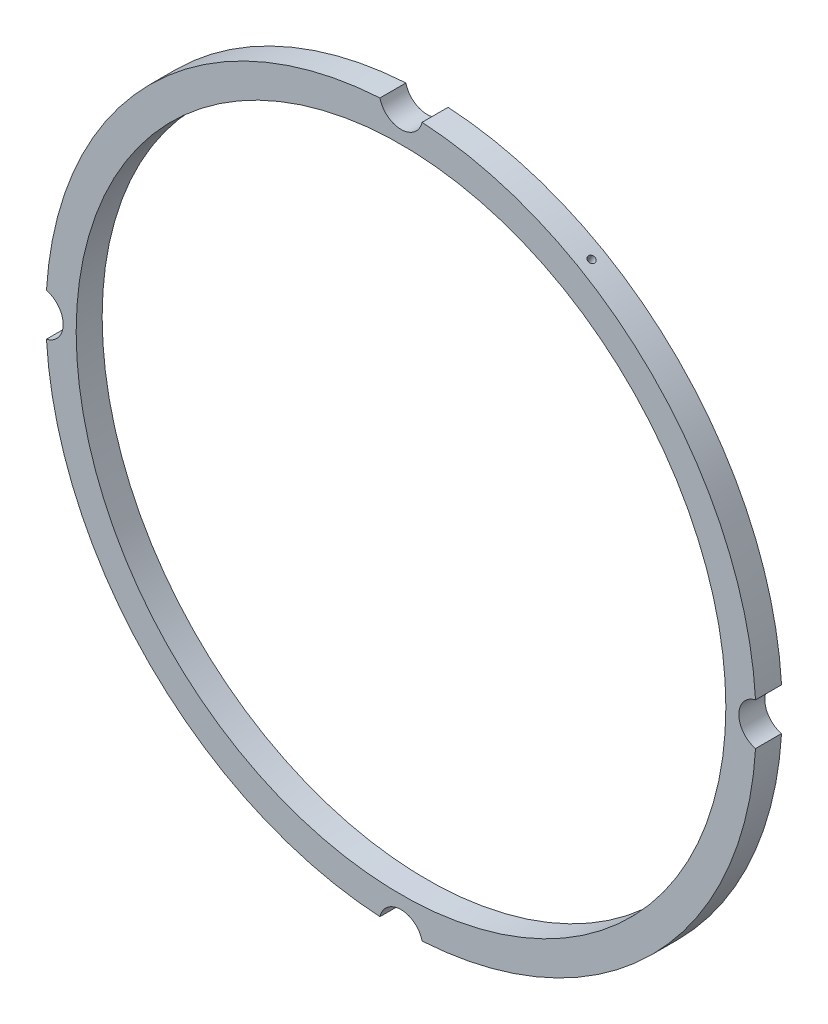
ISO-10303-21;
HEADER;
FILE_DESCRIPTION(('STEP AP214'),'2;1');
FILE_NAME('part.step','',(''),(''),'','','');
FILE_SCHEMA(('AUTOMOTIVE_DESIGN { 1 0 10303 214 1 1 1 1 }'));
ENDSEC;
DATA;
#1=APPLICATION_CONTEXT('core data for automotive mechanical design processes');
#2=APPLICATION_PROTOCOL_DEFINITION('international standard','automotive_design',2000,#1);
#3=PRODUCT_CONTEXT('',#1,'mechanical');
#4=PRODUCT('Part','Part','',(#3));
#5=PRODUCT_RELATED_PRODUCT_CATEGORY('part','',(#4));
#6=PRODUCT_DEFINITION_FORMATION('','',#4);
#7=PRODUCT_DEFINITION_CONTEXT('part definition',#1,'design');
#8=PRODUCT_DEFINITION('design','',#6,#7);
#9=PRODUCT_DEFINITION_SHAPE('','',#8);
#10=(LENGTH_UNIT() NAMED_UNIT(*) SI_UNIT(.MILLI.,.METRE.));
#11=(NAMED_UNIT(*) PLANE_ANGLE_UNIT() SI_UNIT($,.RADIAN.));
#12=(NAMED_UNIT(*) SI_UNIT($,.STERADIAN.) SOLID_ANGLE_UNIT());
#13=UNCERTAINTY_MEASURE_WITH_UNIT(LENGTH_MEASURE(1.E-05),#10,'distance_accuracy_value','');
#14=(GEOMETRIC_REPRESENTATION_CONTEXT(3) GLOBAL_UNCERTAINTY_ASSIGNED_CONTEXT((#13)) GLOBAL_UNIT_ASSIGNED_CONTEXT((#10,
#11,#12)) REPRESENTATION_CONTEXT('',''));
#15=CARTESIAN_POINT('',(0.,0.,0.));
#16=DIRECTION('',(0.,0.,1.));
#17=DIRECTION('',(1.,0.,0.));
#18=AXIS2_PLACEMENT_3D('',#15,#16,#17);
#19=CARTESIAN_POINT('',(0.,0.,6.));
#20=DIRECTION('',(0.,0.,-1.));
#21=DIRECTION('',(-1.,0.,0.));
#22=AXIS2_PLACEMENT_3D('',#19,#20,#21);
#23=CYLINDRICAL_SURFACE('',#22,82.);
#24=CARTESIAN_POINT('',(0.,0.,0.));
#25=DIRECTION('',(0.,0.,1.));
#26=DIRECTION('',(1.,0.,0.));
#27=AXIS2_PLACEMENT_3D('',#24,#25,#26);
#28=CIRCLE('',#27,82.);
#29=CARTESIAN_POINT('',(-4.86723129559619,81.855421686747,0.));
#30=VERTEX_POINT('',#29);
#31=CARTESIAN_POINT('',(-81.8554216867469,4.86723129559705,0.));
#32=VERTEX_POINT('',#31);
#33=EDGE_CURVE('E123',#30,#32,#28,.T.);
#34=ORIENTED_EDGE('',*,*,#33,.T.);
#35=DIRECTION('',(0.,0.,1.));
#36=VECTOR('',#35,1.);
#37=CARTESIAN_POINT('',(-81.8554216867469,4.86723129559704,3.));
#38=LINE('',#37,#36);
#39=CARTESIAN_POINT('',(-81.8554216867469,4.86723129559704,6.));
#40=VERTEX_POINT('',#39);
#41=EDGE_CURVE('E56',#32,#40,#38,.T.);
#42=ORIENTED_EDGE('',*,*,#41,.T.);
#43=CARTESIAN_POINT('',(0.,0.,6.));
#44=DIRECTION('',(0.,0.,1.));
#45=DIRECTION('',(1.,0.,0.));
#46=AXIS2_PLACEMENT_3D('',#43,#44,#45);
#47=CIRCLE('',#46,82.);
#48=CARTESIAN_POINT('',(-4.86723129559619,81.855421686747,6.));
#49=VERTEX_POINT('',#48);
#50=EDGE_CURVE('E130',#49,#40,#47,.T.);
#51=ORIENTED_EDGE('',*,*,#50,.F.);
#52=DIRECTION('',(0.,0.,1.));
#53=VECTOR('',#52,1.);
#54=CARTESIAN_POINT('',(-4.86723129559619,81.855421686747,3.));
#55=LINE('',#54,#53);
#56=EDGE_CURVE('E132',#49,#30,#55,.F.);
#57=ORIENTED_EDGE('',*,*,#56,.T.);
#58=EDGE_LOOP('',(#34,#42,#51,#57));
#59=FACE_BOUND('',#58,.T.);
#60=ADVANCED_FACE('F37',(#59),#23,.T.);
#61=CARTESIAN_POINT('',(-81.8554216867471,-4.86723129559533,6.));
#62=VERTEX_POINT('',#61);
#63=CARTESIAN_POINT('',(-4.86723129559619,-81.855421686747,6.));
#64=VERTEX_POINT('',#63);
#65=EDGE_CURVE('E116',#62,#64,#47,.T.);
#66=ORIENTED_EDGE('',*,*,#65,.F.);
#67=DIRECTION('',(0.,0.,1.));
#68=VECTOR('',#67,1.);
#69=CARTESIAN_POINT('',(-81.8554216867471,-4.86723129559533,3.));
#70=LINE('',#69,#68);
#71=CARTESIAN_POINT('',(-81.8554216867471,-4.86723129559533,0.));
#72=VERTEX_POINT('',#71);
#73=EDGE_CURVE('E107',#62,#72,#70,.F.);
#74=ORIENTED_EDGE('',*,*,#73,.T.);
#75=CARTESIAN_POINT('',(-4.86723129559619,-81.855421686747,0.));
#76=VERTEX_POINT('',#75);
#77=EDGE_CURVE('E64',#72,#76,#28,.T.);
#78=ORIENTED_EDGE('',*,*,#77,.T.);
#79=DIRECTION('',(0.,0.,1.));
#80=VECTOR('',#79,1.);
#81=CARTESIAN_POINT('',(-4.86723129559619,-81.855421686747,3.));
#82=LINE('',#81,#80);
#83=EDGE_CURVE('E161',#76,#64,#82,.T.);
#84=ORIENTED_EDGE('',*,*,#83,.T.);
#85=EDGE_LOOP('',(#66,#74,#78,#84));
#86=FACE_BOUND('',#85,.T.);
#87=ADVANCED_FACE('F115',(#86),#23,.T.);
#88=CARTESIAN_POINT('',(4.86723129559619,-81.855421686747,6.));
#89=VERTEX_POINT('',#88);
#90=CARTESIAN_POINT('',(81.855421686747,-4.86723129559647,6.));
#91=VERTEX_POINT('',#90);
#92=EDGE_CURVE('E146',#89,#91,#47,.T.);
#93=ORIENTED_EDGE('',*,*,#92,.F.);
#94=DIRECTION('',(0.,0.,1.));
#95=VECTOR('',#94,1.);
#96=CARTESIAN_POINT('',(4.86723129559619,-81.855421686747,3.));
#97=LINE('',#96,#95);
#98=CARTESIAN_POINT('',(4.86723129559619,-81.855421686747,0.));
#99=VERTEX_POINT('',#98);
#100=EDGE_CURVE('E214',#89,#99,#97,.F.);
#101=ORIENTED_EDGE('',*,*,#100,.T.);
#102=CARTESIAN_POINT('',(81.855421686747,-4.86723129559647,0.));
#103=VERTEX_POINT('',#102);
#104=EDGE_CURVE('E124',#99,#103,#28,.T.);
#105=ORIENTED_EDGE('',*,*,#104,.T.);
#106=DIRECTION('',(0.,0.,1.));
#107=VECTOR('',#106,1.);
#108=CARTESIAN_POINT('',(81.855421686747,-4.86723129559647,3.));
#109=LINE('',#108,#107);
#110=EDGE_CURVE('E49',#103,#91,#109,.T.);
#111=ORIENTED_EDGE('',*,*,#110,.T.);
#112=EDGE_LOOP('',(#93,#101,#105,#111));
#113=FACE_BOUND('',#112,.T.);
#114=ADVANCED_FACE('F144',(#113),#23,.T.);
#115=CARTESIAN_POINT('',(0.,0.,6.));
#116=DIRECTION('',(0.,0.,1.));
#117=DIRECTION('',(1.,0.,0.));
#118=AXIS2_PLACEMENT_3D('',#115,#116,#117);
#119=PLANE('',#118);
#120=CARTESIAN_POINT('',(-83.,8.6937885337194E-13,6.));
#121=DIRECTION('',(0.,0.,1.));
#122=DIRECTION('',(0.,1.,0.));
#123=AXIS2_PLACEMENT_3D('',#120,#121,#122);
#124=CIRCLE('',#123,5.);
#125=EDGE_CURVE('E112',#62,#40,#124,.T.);
#126=ORIENTED_EDGE('',*,*,#125,.F.);
#127=ORIENTED_EDGE('',*,*,#65,.T.);
#128=CARTESIAN_POINT('',(0.,-83.,6.));
#129=DIRECTION('',(0.,0.,1.));
#130=DIRECTION('',(-1.,0.,0.));
#131=AXIS2_PLACEMENT_3D('',#128,#129,#130);
#132=CIRCLE('',#131,5.);
#133=EDGE_CURVE('E206',#89,#64,#132,.T.);
#134=ORIENTED_EDGE('',*,*,#133,.F.);
#135=ORIENTED_EDGE('',*,*,#92,.T.);
#136=CARTESIAN_POINT('',(83.,-2.8979295112398E-13,6.));
#137=DIRECTION('',(0.,0.,1.));
#138=DIRECTION('',(0.,-1.,0.));
#139=AXIS2_PLACEMENT_3D('',#136,#137,#138);
#140=CIRCLE('',#139,5.);
#141=CARTESIAN_POINT('',(81.855421686747,4.8672312955959,6.));
#142=VERTEX_POINT('',#141);
#143=EDGE_CURVE('E153',#142,#91,#140,.T.);
#144=ORIENTED_EDGE('',*,*,#143,.F.);
#145=CARTESIAN_POINT('',(4.86723129559619,81.855421686747,6.));
#146=VERTEX_POINT('',#145);
#147=EDGE_CURVE('E126',#142,#146,#47,.T.);
#148=ORIENTED_EDGE('',*,*,#147,.T.);
#149=CARTESIAN_POINT('',(0.,83.,6.));
#150=DIRECTION('',(0.,0.,1.));
#151=DIRECTION('',(1.,0.,0.));
#152=AXIS2_PLACEMENT_3D('',#149,#150,#151);
#153=CIRCLE('',#152,5.);
#154=EDGE_CURVE('E156',#49,#146,#153,.T.);
#155=ORIENTED_EDGE('',*,*,#154,.F.);
#156=ORIENTED_EDGE('',*,*,#50,.T.);
#157=EDGE_LOOP('',(#126,#127,#134,#135,#144,#148,#155,#156));
#158=FACE_BOUND('',#157,.T.);
#159=CARTESIAN_POINT('',(0.,0.,6.));
#160=DIRECTION('',(0.,0.,1.));
#161=DIRECTION('',(1.,0.,0.));
#162=AXIS2_PLACEMENT_3D('',#159,#160,#161);
#163=CIRCLE('',#162,75.);
#164=CARTESIAN_POINT('',(75.,0.,6.));
#165=VERTEX_POINT('',#164);
#166=EDGE_CURVE('E168',#165,#165,#163,.T.);
#167=ORIENTED_EDGE('',*,*,#166,.F.);
#168=EDGE_LOOP('',(#167));
#169=FACE_BOUND('',#168,.T.);
#170=ADVANCED_FACE('F202',(#158,#169),#119,.T.);
#171=CARTESIAN_POINT('',(0.,0.,0.));
#172=DIRECTION('',(0.,0.,1.));
#173=DIRECTION('',(1.,0.,0.));
#174=AXIS2_PLACEMENT_3D('',#171,#172,#173);
#175=PLANE('',#174);
#176=ORIENTED_EDGE('',*,*,#77,.F.);
#177=CARTESIAN_POINT('',(-83.,8.6937885337194E-13,0.));
#178=DIRECTION('',(0.,0.,1.));
#179=DIRECTION('',(0.,1.,0.));
#180=AXIS2_PLACEMENT_3D('',#177,#178,#179);
#181=CIRCLE('',#180,5.);
#182=EDGE_CURVE('E105',#72,#32,#181,.T.);
#183=ORIENTED_EDGE('',*,*,#182,.T.);
#184=ORIENTED_EDGE('',*,*,#33,.F.);
#185=CARTESIAN_POINT('',(0.,83.,0.));
#186=DIRECTION('',(0.,0.,1.));
#187=DIRECTION('',(1.,0.,0.));
#188=AXIS2_PLACEMENT_3D('',#185,#186,#187);
#189=CIRCLE('',#188,5.);
#190=CARTESIAN_POINT('',(4.86723129559619,81.855421686747,0.));
#191=VERTEX_POINT('',#190);
#192=EDGE_CURVE('E159',#30,#191,#189,.T.);
#193=ORIENTED_EDGE('',*,*,#192,.T.);
#194=CARTESIAN_POINT('',(81.855421686747,4.8672312955959,0.));
#195=VERTEX_POINT('',#194);
#196=EDGE_CURVE('E127',#195,#191,#28,.T.);
#197=ORIENTED_EDGE('',*,*,#196,.F.);
#198=CARTESIAN_POINT('',(83.,-2.8979295112398E-13,0.));
#199=DIRECTION('',(0.,0.,1.));
#200=DIRECTION('',(0.,-1.,0.));
#201=AXIS2_PLACEMENT_3D('',#198,#199,#200);
#202=CIRCLE('',#201,5.);
#203=EDGE_CURVE('E151',#195,#103,#202,.T.);
#204=ORIENTED_EDGE('',*,*,#203,.T.);
#205=ORIENTED_EDGE('',*,*,#104,.F.);
#206=CARTESIAN_POINT('',(0.,-83.,0.));
#207=DIRECTION('',(0.,0.,1.));
#208=DIRECTION('',(-1.,0.,0.));
#209=AXIS2_PLACEMENT_3D('',#206,#207,#208);
#210=CIRCLE('',#209,5.);
#211=EDGE_CURVE('E122',#99,#76,#210,.T.);
#212=ORIENTED_EDGE('',*,*,#211,.T.);
#213=EDGE_LOOP('',(#176,#183,#184,#193,#197,#204,#205,#212));
#214=FACE_BOUND('',#213,.T.);
#215=CARTESIAN_POINT('',(0.,0.,0.));
#216=DIRECTION('',(0.,0.,1.));
#217=DIRECTION('',(1.,0.,0.));
#218=AXIS2_PLACEMENT_3D('',#215,#216,#217);
#219=CIRCLE('',#218,75.);
#220=CARTESIAN_POINT('',(75.,0.,0.));
#221=VERTEX_POINT('',#220);
#222=EDGE_CURVE('E166',#221,#221,#219,.T.);
#223=ORIENTED_EDGE('',*,*,#222,.T.);
#224=EDGE_LOOP('',(#223));
#225=FACE_BOUND('',#224,.T.);
#226=ADVANCED_FACE('F119',(#214,#225),#175,.F.);
#227=CARTESIAN_POINT('',(40.3052284110281,71.4107034185693,3.));
#228=CARTESIAN_POINT('',(40.305230162785,71.4107024681233,2.95506479609301));
#229=CARTESIAN_POINT('',(40.3085368078791,71.40883642493,2.91009703714875));
#230=CARTESIAN_POINT('',(40.3216802135916,71.4014156688339,2.82140003350558));
#231=CARTESIAN_POINT('',(40.3315248278901,71.3958565196163,2.7776723443821));
#232=CARTESIAN_POINT('',(40.3574592527584,71.3811999286591,2.69275330768963));
#233=CARTESIAN_POINT('',(40.3735460727166,71.3721041812829,2.6515607564808));
#234=CARTESIAN_POINT('',(40.4114971299767,71.3506227921757,2.57287429083479));
#235=CARTESIAN_POINT('',(40.4333599334488,71.3382379669211,2.53537946164327));
#236=CARTESIAN_POINT('',(40.4822388609424,71.3105120161913,2.46513443541361));
#237=CARTESIAN_POINT('',(40.5092556770344,71.2951704936937,2.43238487660122));
#238=CARTESIAN_POINT('',(40.5676657214676,71.2619507473826,2.37256517048709));
#239=CARTESIAN_POINT('',(40.59905912185,71.2440724238483,2.34549524655357));
#240=CARTESIAN_POINT('',(40.6653214679689,71.2062713712898,2.29780471692709));
#241=CARTESIAN_POINT('',(40.7001904182244,71.1863486396075,2.27718411961991));
#242=CARTESIAN_POINT('',(40.772406334745,71.1450111456783,2.24297779787521));
#243=CARTESIAN_POINT('',(40.8097532955037,71.1235963867468,2.22939205780613));
#244=CARTESIAN_POINT('',(40.8858585322044,71.0798740635081,2.2096414437845));
#245=CARTESIAN_POINT('',(40.9246167652487,71.0575665263361,2.20347634446412));
#246=CARTESIAN_POINT('',(41.0024427076472,71.0126869615936,2.19874133559804));
#247=CARTESIAN_POINT('',(41.0415104163721,70.9901149345609,2.20017141060813));
#248=CARTESIAN_POINT('',(41.1188455717403,70.945348935138,2.21058592631372));
#249=CARTESIAN_POINT('',(41.1571130452983,70.9231549500377,2.21957011251892));
#250=CARTESIAN_POINT('',(41.2317665366884,70.8797805669154,2.24483743505819));
#251=CARTESIAN_POINT('',(41.2681525523058,70.8586001700864,2.26112057998316));
#252=CARTESIAN_POINT('',(41.3380172194721,70.8178647619419,2.3005238820961));
#253=CARTESIAN_POINT('',(41.3714958216182,70.7983097782456,2.32364415543101));
#254=CARTESIAN_POINT('',(41.434603016724,70.7613949232539,2.37606530348474));
#255=CARTESIAN_POINT('',(41.4642316101463,70.7440350516948,2.40536617746083));
#256=CARTESIAN_POINT('',(41.5188083007378,70.7120185025764,2.46931822819109));
#257=CARTESIAN_POINT('',(41.5437562021976,70.6973619380483,2.5039696285513));
#258=CARTESIAN_POINT('',(41.5882710512857,70.6711849340483,2.57763829735254));
#259=CARTESIAN_POINT('',(41.6078379981956,70.6596644949952,2.61665556637642));
#260=CARTESIAN_POINT('',(41.641043626485,70.640100926749,2.69794850712354));
#261=CARTESIAN_POINT('',(41.6546823022913,70.6320578008251,2.74022418191001));
#262=CARTESIAN_POINT('',(41.6756502729947,70.6196879331484,2.8268337992777));
#263=CARTESIAN_POINT('',(41.6829795699621,70.6153611901761,2.87116774118354));
#264=CARTESIAN_POINT('',(41.6911239668386,70.6105530728755,2.96063342804992));
#265=CARTESIAN_POINT('',(41.6919393353669,70.6100715399797,3.00576514003536));
#266=CARTESIAN_POINT('',(41.6870338226723,70.6129677812092,3.09554693556317));
#267=CARTESIAN_POINT('',(41.6813129419862,70.6163455550177,3.14019701914508));
#268=CARTESIAN_POINT('',(41.6634948178797,70.6268596602104,3.22774720890134));
#269=CARTESIAN_POINT('',(41.6513976958952,70.6339959200141,3.27064734838672));
#270=CARTESIAN_POINT('',(41.6211650638207,70.6518147314161,3.3534808607507));
#271=CARTESIAN_POINT('',(41.6030295531477,70.6624972833568,3.39341423334282));
#272=CARTESIAN_POINT('',(41.5612265203059,70.6870924286367,3.46918206255699));
#273=CARTESIAN_POINT('',(41.537558817141,70.7010051276562,3.50501638501377));
#274=CARTESIAN_POINT('',(41.4853544455829,70.7316497769729,3.57156755198845));
#275=CARTESIAN_POINT('',(41.4568177741148,70.7483817290505,3.60228439327473));
#276=CARTESIAN_POINT('',(41.3956750206665,70.7841743762166,3.65772966893017));
#277=CARTESIAN_POINT('',(41.3630688010143,70.8032351500882,3.68245790062276));
#278=CARTESIAN_POINT('',(41.2947046718655,70.8431290267123,3.72522259144113));
#279=CARTESIAN_POINT('',(41.2589467660966,70.8639621273686,3.74325905848162));
#280=CARTESIAN_POINT('',(41.1852880913143,70.9067969831621,3.77212789441348));
#281=CARTESIAN_POINT('',(41.1473873619883,70.9287987166545,3.78296039668251));
#282=CARTESIAN_POINT('',(41.0705139344065,70.9733390629306,3.7971142516783));
#283=CARTESIAN_POINT('',(41.0315412345227,70.9958776765296,3.80043559299622));
#284=CARTESIAN_POINT('',(40.9536306752187,71.0408485140235,3.79947279646205));
#285=CARTESIAN_POINT('',(40.9146928143604,71.0632807424909,3.7951889885238));
#286=CARTESIAN_POINT('',(40.8379572703114,71.1074061241529,3.77913815237901));
#287=CARTESIAN_POINT('',(40.8001595894107,71.129099275863,3.76737110914376));
#288=CARTESIAN_POINT('',(40.7267814451327,71.1711392536284,3.73668763250792));
#289=CARTESIAN_POINT('',(40.6912010228659,71.1914860547211,3.71777106659268));
#290=CARTESIAN_POINT('',(40.6232765406942,71.2302669838026,3.67332635454546));
#291=CARTESIAN_POINT('',(40.5909323548439,71.2487011862253,3.6477984658466));
#292=CARTESIAN_POINT('',(40.5304074104666,71.2831487094411,3.59085755066492));
#293=CARTESIAN_POINT('',(40.5022263893502,71.2991621829217,3.55944489564428));
#294=CARTESIAN_POINT('',(40.4508278504761,71.328335198352,3.49161477008844));
#295=CARTESIAN_POINT('',(40.4276115676375,71.3414940302556,3.45519605804873));
#296=CARTESIAN_POINT('',(40.3868099222115,71.3646000206399,3.37838044791628));
#297=CARTESIAN_POINT('',(40.3692273551643,71.3745455846659,3.33798158776968));
#298=CARTESIAN_POINT('',(40.340231691055,71.3909377104108,3.25439747070504));
#299=CARTESIAN_POINT('',(40.3288112020707,71.3973884644812,3.21121562216789));
#300=CARTESIAN_POINT('',(40.3155112248783,71.4048988976244,3.13979902324666));
#301=CARTESIAN_POINT('',(40.3116600520628,71.4070729879977,3.11202827082365));
#302=CARTESIAN_POINT('',(40.3065180975612,71.4099755455663,3.05617592082972));
#303=CARTESIAN_POINT('',(40.3052273157971,71.4107040128057,3.02809432326828));
#304=CARTESIAN_POINT('',(40.3052284110281,71.4107034185693,3.));
#305=B_SPLINE_CURVE_WITH_KNOTS('',3,(#227,#228,#229,#230,#231,#232,#233,#234,#235,#236,#237,
#238,#239,#240,#241,#242,#243,#244,#245,#246,#247,#248,#249,#250,#251,#252,#253,#254,#255,#256,
#257,#258,#259,#260,#261,#262,#263,#264,#265,#266,#267,#268,#269,#270,#271,#272,#273,#274,#275,
#276,#277,#278,#279,#280,#281,#282,#283,#284,#285,#286,#287,#288,#289,#290,#291,#292,#293,#294,
#295,#296,#297,#298,#299,#300,#301,#302,#303,#304),.UNSPECIFIED.,.T.,.F.,(4,2,2,2,2,2,2,2,2,2,2,
2,2,2,2,2,2,2,2,2,2,2,2,2,2,2,2,2,2,2,2,2,2,2,2,2,2,2,4),(0.,0.134703067123948,
0.269568238553244,0.404368876326949,0.539136082591836,0.673921397882166,0.808712013005295,
0.943502803389995,1.07829329426615,1.21307969139774,1.3478658144514,1.48264739688011,
1.61742913794746,1.75221316877515,1.88699718340583,2.02178683237556,2.15657649934035,
2.29136629302325,2.42615604247801,2.56094023348926,2.69572441343268,2.83050602649564,
2.96528765257391,3.10007368890394,3.23485981034965,3.36965049281606,3.50444101585781,
3.63922904325403,3.77401727538224,3.9087996604961,4.0435823162964,4.17836747038272,
4.31314737696438,4.44791877874287,4.58272366439786,4.71759533917827,4.85230486249336,
4.93652372208245,5.02074257910249),.UNSPECIFIED.);
#306=CARTESIAN_POINT('',(40.3052284110281,71.4107034185693,3.));
#307=VERTEX_POINT('',#306);
#308=EDGE_CURVE('E11',#307,#307,#305,.T.);
#309=ORIENTED_EDGE('',*,*,#308,.T.);
#310=EDGE_LOOP('',(#309));
#311=FACE_BOUND('',#310,.T.);
#312=ORIENTED_EDGE('',*,*,#147,.F.);
#313=DIRECTION('',(0.,0.,1.));
#314=VECTOR('',#313,1.);
#315=CARTESIAN_POINT('',(81.855421686747,4.8672312955959,3.));
#316=LINE('',#315,#314);
#317=EDGE_CURVE('E138',#142,#195,#316,.F.);
#318=ORIENTED_EDGE('',*,*,#317,.T.);
#319=ORIENTED_EDGE('',*,*,#196,.T.);
#320=DIRECTION('',(0.,0.,1.));
#321=VECTOR('',#320,1.);
#322=CARTESIAN_POINT('',(4.86723129559619,81.855421686747,3.));
#323=LINE('',#322,#321);
#324=EDGE_CURVE('E135',#191,#146,#323,.T.);
#325=ORIENTED_EDGE('',*,*,#324,.T.);
#326=EDGE_LOOP('',(#312,#318,#319,#325));
#327=FACE_BOUND('',#326,.T.);
#328=ADVANCED_FACE('F39',(#311,#327),#23,.T.);
#329=CARTESIAN_POINT('',(0.,0.,6.));
#330=DIRECTION('',(0.,0.,-1.));
#331=DIRECTION('',(-1.,0.,0.));
#332=AXIS2_PLACEMENT_3D('',#329,#330,#331);
#333=CYLINDRICAL_SURFACE('',#332,75.);
#334=CARTESIAN_POINT('',(36.8050462829542,65.3482101370007,3.));
#335=CARTESIAN_POINT('',(36.8050480371068,65.3482091908556,2.9550650202504));
#336=CARTESIAN_POINT('',(36.8083563893281,65.3463461799556,2.91009749094246));
#337=CARTESIAN_POINT('',(36.8215064307599,65.3389372344705,2.82140095562176));
#338=CARTESIAN_POINT('',(36.8313559762903,65.3333868711768,2.77767350494019));
#339=CARTESIAN_POINT('',(36.8573029001601,65.3187526175866,2.69275494634586));
#340=CARTESIAN_POINT('',(36.8733972851322,65.3096704202157,2.65156263419737));
#341=CARTESIAN_POINT('',(36.9113652327449,65.2882193796654,2.57287659923403));
#342=CARTESIAN_POINT('',(36.9332373616623,65.275851351847,2.535381962022));
#343=CARTESIAN_POINT('',(36.9821357786632,65.2481602840425,2.46513702906338));
#344=CARTESIAN_POINT('',(37.0091627888349,65.2328368300614,2.43238739912278));
#345=CARTESIAN_POINT('',(37.0675928290538,65.1996525164563,2.37256749931847));
#346=CARTESIAN_POINT('',(37.0989960311762,65.1817915570551,2.34549745288538));
#347=CARTESIAN_POINT('',(37.165276621277,65.1440224914367,2.29780653018475));
#348=CARTESIAN_POINT('',(37.2001540272983,65.1241143745878,2.27718568741294));
#349=CARTESIAN_POINT('',(37.2723844475244,65.0828017747338,2.24297889347224));
#350=CARTESIAN_POINT('',(37.309737456126,65.0613972951156,2.22939292638149));
#351=CARTESIAN_POINT('',(37.385851456047,65.0176901750221,2.20964196631049));
#352=CARTESIAN_POINT('',(37.4246123956756,64.9953875675174,2.20347670116969));
#353=CARTESIAN_POINT('',(37.5024403148383,64.9505118372576,2.19874132894006));
#354=CARTESIAN_POINT('',(37.541507293736,64.9279387150649,2.20017120606365));
#355=CARTESIAN_POINT('',(37.6188373554944,64.8831647861721,2.21058526118988));
#356=CARTESIAN_POINT('',(37.6571004707224,64.8609639644887,2.21956913443268));
#357=CARTESIAN_POINT('',(37.7317423544195,64.8175707954564,2.24483569725781));
#358=CARTESIAN_POINT('',(37.7681211206258,64.7963784493184,2.26111839560381));
#359=CARTESIAN_POINT('',(37.8379693340923,64.7556153066755,2.3005207415664));
#360=CARTESIAN_POINT('',(37.8714387220741,64.7360445432105,2.32364052844561));
#361=CARTESIAN_POINT('',(37.934526459754,64.6990961367939,2.3760606377374));
#362=CARTESIAN_POINT('',(37.9641448097006,64.6817184937006,2.40536095975093));
#363=CARTESIAN_POINT('',(38.0187013917973,64.6496662631315,2.46931214094038));
#364=CARTESIAN_POINT('',(38.0436393901331,64.6349918106984,2.50396326726652));
#365=CARTESIAN_POINT('',(38.0881356631969,64.6087810653332,2.57763147675292));
#366=CARTESIAN_POINT('',(38.1076939372037,64.597244772822,2.61664856049856));
#367=CARTESIAN_POINT('',(38.1408844541449,64.5776533045459,2.69794124937333));
#368=CARTESIAN_POINT('',(38.1545166903565,64.5695981327303,2.74021685819908));
#369=CARTESIAN_POINT('',(38.1754747513236,64.5572093338679,2.82682645392057));
#370=CARTESIAN_POINT('',(38.1828005784973,64.5528757053942,2.87116044002704));
#371=CARTESIAN_POINT('',(38.1909413824111,64.5480597632868,2.96062594210085));
#372=CARTESIAN_POINT('',(38.1917566800836,64.5475772598144,3.00575741864649));
#373=CARTESIAN_POINT('',(38.186854547518,64.5504775161813,3.09553881341012));
#374=CARTESIAN_POINT('',(38.1811371179785,64.5538602756073,3.14018873167963));
#375=CARTESIAN_POINT('',(38.1633291083601,64.5643896994272,3.22773849669129));
#376=CARTESIAN_POINT('',(38.1512386734367,64.5715362780939,3.27063838326933));
#377=CARTESIAN_POINT('',(38.121021943817,64.58937987047,3.35347150366393));
#378=CARTESIAN_POINT('',(38.1028956482698,64.6000768846797,3.39340473706236));
#379=CARTESIAN_POINT('',(38.0611124544012,64.6247035165116,3.46917268708774));
#380=CARTESIAN_POINT('',(38.0374553396379,64.6386332606425,3.50500724323626));
#381=CARTESIAN_POINT('',(37.9852724588776,64.6693125821188,3.57155900623288));
#382=CARTESIAN_POINT('',(37.9567466895903,64.6860621613697,3.60227620962269));
#383=CARTESIAN_POINT('',(37.8956246465006,64.7218887639564,3.6577225312695));
#384=CARTESIAN_POINT('',(37.863028208343,64.7409658812668,3.6824514076266));
#385=CARTESIAN_POINT('',(37.7946816007971,64.7808892105927,3.72521742401462));
#386=CARTESIAN_POINT('',(37.7589314352171,64.8017354204719,3.7432545721263));
#387=CARTESIAN_POINT('',(37.6852854659991,64.8445917012878,3.77212471767836));
#388=CARTESIAN_POINT('',(37.6473897097049,64.8666017465431,3.78295787401226));
#389=CARTESIAN_POINT('',(37.570522798859,64.9111530416104,3.79711304961452));
#390=CARTESIAN_POINT('',(37.5315516427333,64.9336942922,3.80043505788946));
#391=CARTESIAN_POINT('',(37.4536409057876,64.9786642363913,3.79947358692462));
#392=CARTESIAN_POINT('',(37.4147013234452,65.0010929357281,3.79519049922343));
#393=CARTESIAN_POINT('',(37.3379589704716,65.0452056620496,3.77914120179627));
#394=CARTESIAN_POINT('',(37.3001562021231,65.0668896875391,3.76737497704569));
#395=CARTESIAN_POINT('',(37.2267650922114,65.1089068431069,3.73669322600969));
#396=CARTESIAN_POINT('',(37.1911767916611,65.1292399481661,3.71777756735918));
#397=CARTESIAN_POINT('',(37.1232346218809,65.1679904761977,3.67333473728468));
#398=CARTESIAN_POINT('',(37.0908806269882,65.1864079735984,3.6478078228667));
#399=CARTESIAN_POINT('',(37.0303349483126,65.2208211267837,3.59086865031063));
#400=CARTESIAN_POINT('',(37.0021430357465,65.236816915687,3.55945671587823));
#401=CARTESIAN_POINT('',(36.9507230753817,65.2659554454819,3.49162792346798));
#402=CARTESIAN_POINT('',(36.9274962624952,65.2790974766038,3.45520982405612));
#403=CARTESIAN_POINT('',(36.886674973326,65.3021727146869,3.37839515111329));
#404=CARTESIAN_POINT('',(36.8690833131314,65.3121043173042,3.33799660155311));
#405=CARTESIAN_POINT('',(36.8400719807352,65.3284729390554,3.25441290469289));
#406=CARTESIAN_POINT('',(36.8286449144051,65.3349141447912,3.21123116563503));
#407=CARTESIAN_POINT('',(36.8153363830033,65.3424137824977,3.13981210935176));
#408=CARTESIAN_POINT('',(36.8114824882576,65.3445848245014,3.11203879602761));
#409=CARTESIAN_POINT('',(36.8063368898609,65.3474832975298,3.05618123049377));
#410=CARTESIAN_POINT('',(36.8050451861163,65.3482107286071,3.02809697829542));
#411=CARTESIAN_POINT('',(36.8050462829542,65.3482101370007,3.));
#412=B_SPLINE_CURVE_WITH_KNOTS('',3,(#334,#335,#336,#337,#338,#339,#340,#341,#342,#343,#344,
#345,#346,#347,#348,#349,#350,#351,#352,#353,#354,#355,#356,#357,#358,#359,#360,#361,#362,#363,
#364,#365,#366,#367,#368,#369,#370,#371,#372,#373,#374,#375,#376,#377,#378,#379,#380,#381,#382,
#383,#384,#385,#386,#387,#388,#389,#390,#391,#392,#393,#394,#395,#396,#397,#398,#399,#400,#401,
#402,#403,#404,#405,#406,#407,#408,#409,#410,#411),.UNSPECIFIED.,.T.,.F.,(4,2,2,2,2,2,2,2,2,2,2,
2,2,2,2,2,2,2,2,2,2,2,2,2,2,2,2,2,2,2,2,2,2,2,2,2,2,2,4),(0.,0.134702384884245,
0.269566847771312,0.404366745160631,0.53913322388388,0.67391859438231,0.808709266243902,
0.94350063816686,1.07829170501871,1.21307782814302,1.34786367109516,1.48264407648283,
1.61742464370115,1.7522079564138,1.88699126042393,2.02178129595248,2.15657134955319,
2.29136155606754,2.42615171089691,2.56093522128894,2.69571871726383,2.83049914345485,
2.9652795886429,3.10006530918114,3.23485112080662,3.36964237622916,3.50443346888081,
3.63922158843895,3.77400990527481,3.90879128290841,4.04357293115627,4.17835707488297,
4.31313597979601,4.44790747336685,4.5827124482066,4.71758468521554,4.85229478784963,
4.93652160053774,5.02074841015296),.UNSPECIFIED.);
#413=CARTESIAN_POINT('',(36.8050462829542,65.3482101370007,3.));
#414=VERTEX_POINT('',#413);
#415=EDGE_CURVE('E207',#414,#414,#412,.T.);
#416=ORIENTED_EDGE('',*,*,#415,.F.);
#417=EDGE_LOOP('',(#416));
#418=FACE_BOUND('',#417,.T.);
#419=ORIENTED_EDGE('',*,*,#166,.T.);
#420=EDGE_LOOP('',(#419));
#421=FACE_BOUND('',#420,.T.);
#422=ORIENTED_EDGE('',*,*,#222,.F.);
#423=EDGE_LOOP('',(#422));
#424=FACE_BOUND('',#423,.T.);
#425=ADVANCED_FACE('F173',(#418,#421,#424),#333,.F.);
#426=CARTESIAN_POINT('',(0.,83.,0.));
#427=DIRECTION('',(0.,0.,1.));
#428=DIRECTION('',(1.,0.,0.));
#429=AXIS2_PLACEMENT_3D('',#426,#427,#428);
#430=CYLINDRICAL_SURFACE('',#429,5.);
#431=ORIENTED_EDGE('',*,*,#192,.F.);
#432=ORIENTED_EDGE('',*,*,#56,.F.);
#433=ORIENTED_EDGE('',*,*,#154,.T.);
#434=ORIENTED_EDGE('',*,*,#324,.F.);
#435=EDGE_LOOP('',(#431,#432,#433,#434));
#436=FACE_BOUND('',#435,.T.);
#437=ADVANCED_FACE('F175',(#436),#430,.F.);
#438=CARTESIAN_POINT('',(83.,-2.8979295112398E-13,0.));
#439=DIRECTION('',(0.,0.,1.));
#440=DIRECTION('',(1.,0.,0.));
#441=AXIS2_PLACEMENT_3D('',#438,#439,#440);
#442=CYLINDRICAL_SURFACE('',#441,5.);
#443=ORIENTED_EDGE('',*,*,#203,.F.);
#444=ORIENTED_EDGE('',*,*,#317,.F.);
#445=ORIENTED_EDGE('',*,*,#143,.T.);
#446=ORIENTED_EDGE('',*,*,#110,.F.);
#447=EDGE_LOOP('',(#443,#444,#445,#446));
#448=FACE_BOUND('',#447,.T.);
#449=ADVANCED_FACE('F150',(#448),#442,.F.);
#450=CARTESIAN_POINT('',(0.,-83.,0.));
#451=DIRECTION('',(0.,0.,1.));
#452=DIRECTION('',(1.,0.,0.));
#453=AXIS2_PLACEMENT_3D('',#450,#451,#452);
#454=CYLINDRICAL_SURFACE('',#453,5.);
#455=ORIENTED_EDGE('',*,*,#211,.F.);
#456=ORIENTED_EDGE('',*,*,#100,.F.);
#457=ORIENTED_EDGE('',*,*,#133,.T.);
#458=ORIENTED_EDGE('',*,*,#83,.F.);
#459=EDGE_LOOP('',(#455,#456,#457,#458));
#460=FACE_BOUND('',#459,.T.);
#461=ADVANCED_FACE('F216',(#460),#454,.F.);
#462=CARTESIAN_POINT('',(-83.,8.6937885337194E-13,0.));
#463=DIRECTION('',(0.,0.,1.));
#464=DIRECTION('',(1.,0.,0.));
#465=AXIS2_PLACEMENT_3D('',#462,#463,#464);
#466=CYLINDRICAL_SURFACE('',#465,5.);
#467=ORIENTED_EDGE('',*,*,#182,.F.);
#468=ORIENTED_EDGE('',*,*,#73,.F.);
#469=ORIENTED_EDGE('',*,*,#125,.T.);
#470=ORIENTED_EDGE('',*,*,#41,.F.);
#471=EDGE_LOOP('',(#467,#468,#469,#470));
#472=FACE_BOUND('',#471,.T.);
#473=ADVANCED_FACE('F106',(#472),#466,.F.);
#474=CARTESIAN_POINT('',(41.,71.014083110324,3.));
#475=DIRECTION('',(0.5,0.866025403784439,0.));
#476=DIRECTION('',(-0.866025403784439,0.5,0.));
#477=AXIS2_PLACEMENT_3D('',#474,#475,#476);
#478=CYLINDRICAL_SURFACE('',#477,0.799999999999994);
#479=ORIENTED_EDGE('',*,*,#415,.T.);
#480=EDGE_LOOP('',(#479));
#481=FACE_BOUND('',#480,.T.);
#482=ORIENTED_EDGE('',*,*,#308,.F.);
#483=EDGE_LOOP('',(#482));
#484=FACE_BOUND('',#483,.T.);
#485=ADVANCED_FACE('F223',(#481,#484),#478,.F.);
#486=CLOSED_SHELL('',(#60,#87,#114,#170,#226,#328,#425,#437,#449,#461,#473,#485));
#487=MANIFOLD_SOLID_BREP('B2',#486);
#488=ADVANCED_BREP_SHAPE_REPRESENTATION('',(#18,#487),#14);
#489=SHAPE_DEFINITION_REPRESENTATION(#9,#488);
ENDSEC;
END-ISO-10303-21;
